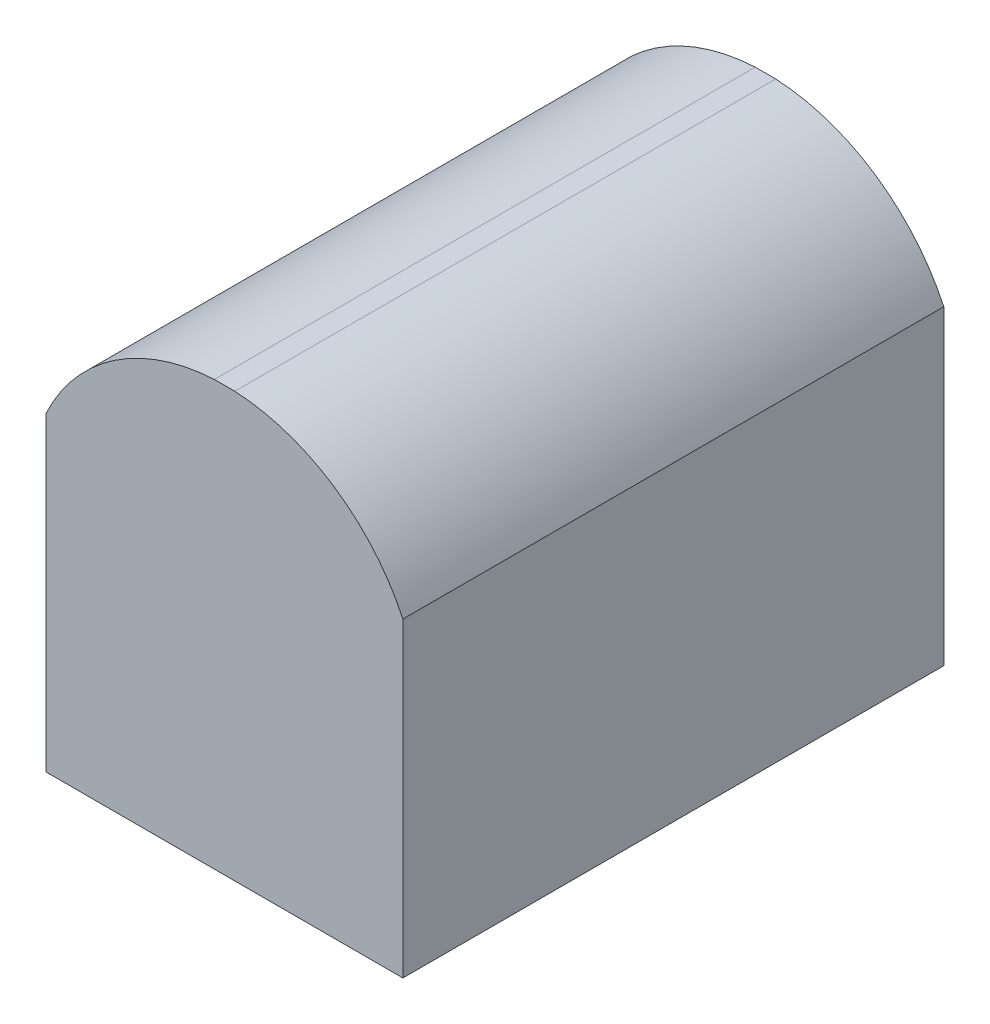
ISO-10303-21;
HEADER;
FILE_DESCRIPTION(('STEP AP214'),'2;1');
FILE_NAME('part.step','',(''),(''),'','','');
FILE_SCHEMA(('AUTOMOTIVE_DESIGN { 1 0 10303 214 1 1 1 1 }'));
ENDSEC;
DATA;
#1=APPLICATION_CONTEXT('core data for automotive mechanical design processes');
#2=APPLICATION_PROTOCOL_DEFINITION('international standard','automotive_design',2000,#1);
#3=PRODUCT_CONTEXT('',#1,'mechanical');
#4=PRODUCT('Part','Part','',(#3));
#5=PRODUCT_RELATED_PRODUCT_CATEGORY('part','',(#4));
#6=PRODUCT_DEFINITION_FORMATION('','',#4);
#7=PRODUCT_DEFINITION_CONTEXT('part definition',#1,'design');
#8=PRODUCT_DEFINITION('design','',#6,#7);
#9=PRODUCT_DEFINITION_SHAPE('','',#8);
#10=(LENGTH_UNIT() NAMED_UNIT(*) SI_UNIT(.MILLI.,.METRE.));
#11=(NAMED_UNIT(*) PLANE_ANGLE_UNIT() SI_UNIT($,.RADIAN.));
#12=(NAMED_UNIT(*) SI_UNIT($,.STERADIAN.) SOLID_ANGLE_UNIT());
#13=UNCERTAINTY_MEASURE_WITH_UNIT(LENGTH_MEASURE(1.E-05),#10,'distance_accuracy_value','');
#14=(GEOMETRIC_REPRESENTATION_CONTEXT(3) GLOBAL_UNCERTAINTY_ASSIGNED_CONTEXT((#13)) GLOBAL_UNIT_ASSIGNED_CONTEXT((#10,
#11,#12)) REPRESENTATION_CONTEXT('',''));
#15=CARTESIAN_POINT('',(0.,0.,0.));
#16=DIRECTION('',(0.,0.,1.));
#17=DIRECTION('',(1.,0.,0.));
#18=AXIS2_PLACEMENT_3D('',#15,#16,#17);
#19=CARTESIAN_POINT('',(-10.4929705744713,7.16342658835966,4.19862));
#20=DIRECTION('',(1.,0.,0.));
#21=DIRECTION('',(0.,0.,-1.));
#22=AXIS2_PLACEMENT_3D('',#19,#20,#21);
#23=PLANE('',#22);
#24=DIRECTION('',(0.,-1.,0.));
#25=VECTOR('',#24,1.);
#26=CARTESIAN_POINT('',(-10.4929705744713,7.16342658835966,0.));
#27=LINE('',#26,#25);
#28=CARTESIAN_POINT('',(-10.4929705744713,9.57642658835966,0.));
#29=VERTEX_POINT('',#28);
#30=CARTESIAN_POINT('',(-10.4929705744713,7.16342658835966,0.));
#31=VERTEX_POINT('',#30);
#32=EDGE_CURVE('E116',#29,#31,#27,.T.);
#33=ORIENTED_EDGE('',*,*,#32,.T.);
#34=DIRECTION('',(0.,0.,-1.));
#35=VECTOR('',#34,1.);
#36=CARTESIAN_POINT('',(-10.4929705744713,7.16342658835966,4.19862));
#37=LINE('',#36,#35);
#38=CARTESIAN_POINT('',(-10.4929705744713,7.16342658835966,4.19862));
#39=VERTEX_POINT('',#38);
#40=EDGE_CURVE('E11',#39,#31,#37,.T.);
#41=ORIENTED_EDGE('',*,*,#40,.F.);
#42=DIRECTION('',(0.,-1.,0.));
#43=VECTOR('',#42,1.);
#44=CARTESIAN_POINT('',(-10.4929705744713,7.16342658835966,4.19862));
#45=LINE('',#44,#43);
#46=CARTESIAN_POINT('',(-10.4929705744713,9.57642658835966,4.19862));
#47=VERTEX_POINT('',#46);
#48=EDGE_CURVE('E126',#47,#39,#45,.T.);
#49=ORIENTED_EDGE('',*,*,#48,.F.);
#50=DIRECTION('',(0.,0.,-1.));
#51=VECTOR('',#50,1.);
#52=CARTESIAN_POINT('',(-10.4929705744713,9.57642658835966,4.19862));
#53=LINE('',#52,#51);
#54=EDGE_CURVE('E112',#47,#29,#53,.T.);
#55=ORIENTED_EDGE('',*,*,#54,.T.);
#56=EDGE_LOOP('',(#33,#41,#49,#55));
#57=FACE_BOUND('',#56,.T.);
#58=ADVANCED_FACE('F32',(#57),#23,.F.);
#59=CARTESIAN_POINT('',(-10.4929705744713,7.16342658835966,4.19862));
#60=DIRECTION('',(0.,1.,0.));
#61=DIRECTION('',(0.,0.,1.));
#62=AXIS2_PLACEMENT_3D('',#59,#60,#61);
#63=PLANE('',#62);
#64=DIRECTION('',(1.,0.,0.));
#65=VECTOR('',#64,1.);
#66=CARTESIAN_POINT('',(-10.4929705744713,7.16342658835966,0.));
#67=LINE('',#66,#65);
#68=CARTESIAN_POINT('',(-7.72437057447134,7.16342658835966,0.));
#69=VERTEX_POINT('',#68);
#70=EDGE_CURVE('E119',#31,#69,#67,.T.);
#71=ORIENTED_EDGE('',*,*,#70,.T.);
#72=DIRECTION('',(0.,0.,-1.));
#73=VECTOR('',#72,1.);
#74=CARTESIAN_POINT('',(-7.72437057447134,7.16342658835966,4.19862));
#75=LINE('',#74,#73);
#76=CARTESIAN_POINT('',(-7.72437057447134,7.16342658835966,4.19862));
#77=VERTEX_POINT('',#76);
#78=EDGE_CURVE('E40',#77,#69,#75,.T.);
#79=ORIENTED_EDGE('',*,*,#78,.F.);
#80=DIRECTION('',(1.,0.,0.));
#81=VECTOR('',#80,1.);
#82=CARTESIAN_POINT('',(-10.4929705744713,7.16342658835966,4.19862));
#83=LINE('',#82,#81);
#84=EDGE_CURVE('E85',#39,#77,#83,.T.);
#85=ORIENTED_EDGE('',*,*,#84,.F.);
#86=ORIENTED_EDGE('',*,*,#40,.T.);
#87=EDGE_LOOP('',(#71,#79,#85,#86));
#88=FACE_BOUND('',#87,.T.);
#89=ADVANCED_FACE('F150',(#88),#63,.F.);
#90=CARTESIAN_POINT('',(-7.72437057447134,7.16342658835966,4.19862));
#91=DIRECTION('',(-1.,0.,0.));
#92=DIRECTION('',(0.,0.,1.));
#93=AXIS2_PLACEMENT_3D('',#90,#91,#92);
#94=PLANE('',#93);
#95=DIRECTION('',(0.,1.,0.));
#96=VECTOR('',#95,1.);
#97=CARTESIAN_POINT('',(-7.72437057447134,7.16342658835966,0.));
#98=LINE('',#97,#96);
#99=CARTESIAN_POINT('',(-7.72437057447134,9.57642658835966,0.));
#100=VERTEX_POINT('',#99);
#101=EDGE_CURVE('E121',#69,#100,#98,.T.);
#102=ORIENTED_EDGE('',*,*,#101,.T.);
#103=DIRECTION('',(0.,0.,-1.));
#104=VECTOR('',#103,1.);
#105=CARTESIAN_POINT('',(-7.72437057447134,9.57642658835966,4.19862));
#106=LINE('',#105,#104);
#107=CARTESIAN_POINT('',(-7.72437057447134,9.57642658835966,4.19862));
#108=VERTEX_POINT('',#107);
#109=EDGE_CURVE('E107',#108,#100,#106,.T.);
#110=ORIENTED_EDGE('',*,*,#109,.F.);
#111=DIRECTION('',(0.,1.,0.));
#112=VECTOR('',#111,1.);
#113=CARTESIAN_POINT('',(-7.72437057447134,7.16342658835966,4.19862));
#114=LINE('',#113,#112);
#115=EDGE_CURVE('E98',#77,#108,#114,.T.);
#116=ORIENTED_EDGE('',*,*,#115,.F.);
#117=ORIENTED_EDGE('',*,*,#78,.T.);
#118=EDGE_LOOP('',(#102,#110,#116,#117));
#119=FACE_BOUND('',#118,.T.);
#120=ADVANCED_FACE('F132',(#119),#94,.F.);
#121=CARTESIAN_POINT('',(-9.10867057447134,8.92904080873403,4.19862));
#122=DIRECTION('',(0.,0.,-1.));
#123=DIRECTION('',(-1.,0.,0.));
#124=AXIS2_PLACEMENT_3D('',#121,#122,#123);
#125=CYLINDRICAL_SURFACE('',#124,1.52819986836195);
#126=CARTESIAN_POINT('',(-9.10867057447134,8.92904080873403,0.));
#127=DIRECTION('',(0.,0.,1.));
#128=DIRECTION('',(-1.,0.,0.));
#129=AXIS2_PLACEMENT_3D('',#126,#127,#128);
#130=CIRCLE('',#129,1.52819986836195);
#131=CARTESIAN_POINT('',(-9.02912326092049,10.4551689365688,0.));
#132=VERTEX_POINT('',#131);
#133=EDGE_CURVE('E106',#100,#132,#130,.T.);
#134=ORIENTED_EDGE('',*,*,#133,.T.);
#135=DIRECTION('',(0.,0.,-1.));
#136=VECTOR('',#135,1.);
#137=CARTESIAN_POINT('',(-9.02912326092049,10.4551689365688,4.19862));
#138=LINE('',#137,#136);
#139=CARTESIAN_POINT('',(-9.02912326092049,10.4551689365688,4.19862));
#140=VERTEX_POINT('',#139);
#141=EDGE_CURVE('E103',#140,#132,#138,.T.);
#142=ORIENTED_EDGE('',*,*,#141,.F.);
#143=CARTESIAN_POINT('',(-9.10867057447134,8.92904080873403,4.19862));
#144=DIRECTION('',(0.,0.,1.));
#145=DIRECTION('',(-1.,0.,0.));
#146=AXIS2_PLACEMENT_3D('',#143,#144,#145);
#147=CIRCLE('',#146,1.52819986836195);
#148=EDGE_CURVE('E92',#108,#140,#147,.T.);
#149=ORIENTED_EDGE('',*,*,#148,.F.);
#150=ORIENTED_EDGE('',*,*,#109,.T.);
#151=EDGE_LOOP('',(#134,#142,#149,#150));
#152=FACE_BOUND('',#151,.T.);
#153=ADVANCED_FACE('F104',(#152),#125,.T.);
#154=CARTESIAN_POINT('',(-9.18821788802218,10.4551689365688,4.19862));
#155=DIRECTION('',(0.,-1.,0.));
#156=DIRECTION('',(0.,0.,-1.));
#157=AXIS2_PLACEMENT_3D('',#154,#155,#156);
#158=PLANE('',#157);
#159=DIRECTION('',(-1.,0.,0.));
#160=VECTOR('',#159,1.);
#161=CARTESIAN_POINT('',(-9.18821788802218,10.4551689365688,0.));
#162=LINE('',#161,#160);
#163=CARTESIAN_POINT('',(-9.18821788802218,10.4551689365688,0.));
#164=VERTEX_POINT('',#163);
#165=EDGE_CURVE('E71',#132,#164,#162,.T.);
#166=ORIENTED_EDGE('',*,*,#165,.T.);
#167=DIRECTION('',(0.,0.,-1.));
#168=VECTOR('',#167,1.);
#169=CARTESIAN_POINT('',(-9.18821788802218,10.4551689365688,4.19862));
#170=LINE('',#169,#168);
#171=CARTESIAN_POINT('',(-9.18821788802218,10.4551689365688,4.19862));
#172=VERTEX_POINT('',#171);
#173=EDGE_CURVE('E108',#172,#164,#170,.T.);
#174=ORIENTED_EDGE('',*,*,#173,.F.);
#175=DIRECTION('',(-1.,0.,0.));
#176=VECTOR('',#175,1.);
#177=CARTESIAN_POINT('',(-9.18821788802218,10.4551689365688,4.19862));
#178=LINE('',#177,#176);
#179=EDGE_CURVE('E96',#140,#172,#178,.T.);
#180=ORIENTED_EDGE('',*,*,#179,.F.);
#181=ORIENTED_EDGE('',*,*,#141,.T.);
#182=EDGE_LOOP('',(#166,#174,#180,#181));
#183=FACE_BOUND('',#182,.T.);
#184=ADVANCED_FACE('F110',(#183),#158,.F.);
#185=CARTESIAN_POINT('',(-9.10867057447134,8.92904080873403,4.19862));
#186=DIRECTION('',(0.,0.,-1.));
#187=DIRECTION('',(-1.,0.,0.));
#188=AXIS2_PLACEMENT_3D('',#185,#186,#187);
#189=CYLINDRICAL_SURFACE('',#188,1.52819986836195);
#190=CARTESIAN_POINT('',(-9.10867057447134,8.92904080873403,0.));
#191=DIRECTION('',(0.,0.,1.));
#192=DIRECTION('',(-1.,0.,0.));
#193=AXIS2_PLACEMENT_3D('',#190,#191,#192);
#194=CIRCLE('',#193,1.52819986836195);
#195=EDGE_CURVE('E77',#164,#29,#194,.T.);
#196=ORIENTED_EDGE('',*,*,#195,.T.);
#197=ORIENTED_EDGE('',*,*,#54,.F.);
#198=CARTESIAN_POINT('',(-9.10867057447134,8.92904080873403,4.19862));
#199=DIRECTION('',(0.,0.,1.));
#200=DIRECTION('',(-1.,0.,0.));
#201=AXIS2_PLACEMENT_3D('',#198,#199,#200);
#202=CIRCLE('',#201,1.52819986836195);
#203=EDGE_CURVE('E48',#172,#47,#202,.T.);
#204=ORIENTED_EDGE('',*,*,#203,.F.);
#205=ORIENTED_EDGE('',*,*,#173,.T.);
#206=EDGE_LOOP('',(#196,#197,#204,#205));
#207=FACE_BOUND('',#206,.T.);
#208=ADVANCED_FACE('F139',(#207),#189,.T.);
#209=CARTESIAN_POINT('',(-9.10867057447134,8.92904080873403,4.19862));
#210=DIRECTION('',(0.,0.,-1.));
#211=DIRECTION('',(-1.,0.,0.));
#212=AXIS2_PLACEMENT_3D('',#209,#210,#211);
#213=PLANE('',#212);
#214=ORIENTED_EDGE('',*,*,#48,.T.);
#215=ORIENTED_EDGE('',*,*,#84,.T.);
#216=ORIENTED_EDGE('',*,*,#115,.T.);
#217=ORIENTED_EDGE('',*,*,#148,.T.);
#218=ORIENTED_EDGE('',*,*,#179,.T.);
#219=ORIENTED_EDGE('',*,*,#203,.T.);
#220=EDGE_LOOP('',(#214,#215,#216,#217,#218,#219));
#221=FACE_BOUND('',#220,.T.);
#222=ADVANCED_FACE('F94',(#221),#213,.F.);
#223=CARTESIAN_POINT('',(-9.10867057447134,8.92904080873403,0.));
#224=DIRECTION('',(0.,0.,-1.));
#225=DIRECTION('',(-1.,0.,0.));
#226=AXIS2_PLACEMENT_3D('',#223,#224,#225);
#227=PLANE('',#226);
#228=ORIENTED_EDGE('',*,*,#32,.F.);
#229=ORIENTED_EDGE('',*,*,#195,.F.);
#230=ORIENTED_EDGE('',*,*,#165,.F.);
#231=ORIENTED_EDGE('',*,*,#133,.F.);
#232=ORIENTED_EDGE('',*,*,#101,.F.);
#233=ORIENTED_EDGE('',*,*,#70,.F.);
#234=EDGE_LOOP('',(#228,#229,#230,#231,#232,#233));
#235=FACE_BOUND('',#234,.T.);
#236=ADVANCED_FACE('F135',(#235),#227,.T.);
#237=CLOSED_SHELL('',(#58,#89,#120,#153,#184,#208,#222,#236));
#238=MANIFOLD_SOLID_BREP('B2',#237);
#239=ADVANCED_BREP_SHAPE_REPRESENTATION('',(#18,#238),#14);
#240=SHAPE_DEFINITION_REPRESENTATION(#9,#239);
ENDSEC;
END-ISO-10303-21;
